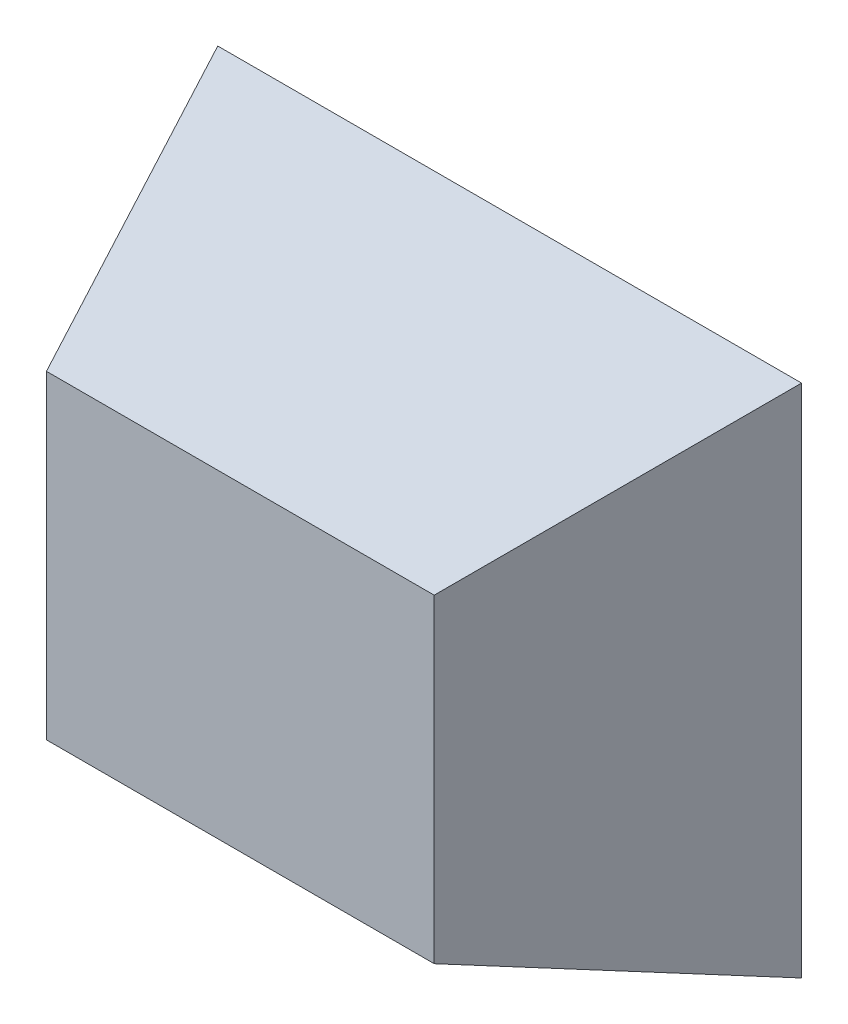
ISO-10303-21;
HEADER;
FILE_DESCRIPTION(('STEP AP214'),'2;1');
FILE_NAME('part.step','',(''),(''),'','','');
FILE_SCHEMA(('AUTOMOTIVE_DESIGN { 1 0 10303 214 1 1 1 1 }'));
ENDSEC;
DATA;
#1=APPLICATION_CONTEXT('core data for automotive mechanical design processes');
#2=APPLICATION_PROTOCOL_DEFINITION('international standard','automotive_design',2000,#1);
#3=PRODUCT_CONTEXT('',#1,'mechanical');
#4=PRODUCT('Part','Part','',(#3));
#5=PRODUCT_RELATED_PRODUCT_CATEGORY('part','',(#4));
#6=PRODUCT_DEFINITION_FORMATION('','',#4);
#7=PRODUCT_DEFINITION_CONTEXT('part definition',#1,'design');
#8=PRODUCT_DEFINITION('design','',#6,#7);
#9=PRODUCT_DEFINITION_SHAPE('','',#8);
#10=(LENGTH_UNIT() NAMED_UNIT(*) SI_UNIT(.MILLI.,.METRE.));
#11=(NAMED_UNIT(*) PLANE_ANGLE_UNIT() SI_UNIT($,.RADIAN.));
#12=(NAMED_UNIT(*) SI_UNIT($,.STERADIAN.) SOLID_ANGLE_UNIT());
#13=UNCERTAINTY_MEASURE_WITH_UNIT(LENGTH_MEASURE(1.E-05),#10,'distance_accuracy_value','');
#14=(GEOMETRIC_REPRESENTATION_CONTEXT(3) GLOBAL_UNCERTAINTY_ASSIGNED_CONTEXT((#13)) GLOBAL_UNIT_ASSIGNED_CONTEXT((#10,
#11,#12)) REPRESENTATION_CONTEXT('',''));
#15=CARTESIAN_POINT('',(0.,0.,0.));
#16=DIRECTION('',(0.,0.,1.));
#17=DIRECTION('',(1.,0.,0.));
#18=AXIS2_PLACEMENT_3D('',#15,#16,#17);
#19=CARTESIAN_POINT('',(0.,0.,0.));
#20=DIRECTION('',(-0.939692620785908,0.,0.342020143325669));
#21=DIRECTION('',(0.342020143325669,0.,0.939692620785908));
#22=AXIS2_PLACEMENT_3D('',#19,#20,#21);
#23=PLANE('',#22);
#24=DIRECTION('',(0.,-1.,0.));
#25=VECTOR('',#24,1.);
#26=CARTESIAN_POINT('',(0.,0.,0.));
#27=LINE('',#26,#25);
#28=CARTESIAN_POINT('',(0.,0.,0.));
#29=VERTEX_POINT('',#28);
#30=CARTESIAN_POINT('',(0.,-38.2597131047897,0.));
#31=VERTEX_POINT('',#30);
#32=EDGE_CURVE('E83',#29,#31,#27,.T.);
#33=ORIENTED_EDGE('',*,*,#32,.T.);
#34=DIRECTION('',(-0.323615577118185,-0.323615577118185,-0.889126490715988));
#35=VECTOR('',#34,1.);
#36=CARTESIAN_POINT('',(0.,-38.2597131047897,0.));
#37=LINE('',#36,#35);
#38=CARTESIAN_POINT('',(7.27940468532406,-30.9803084194656,20.));
#39=VERTEX_POINT('',#38);
#40=EDGE_CURVE('E11',#39,#31,#37,.T.);
#41=ORIENTED_EDGE('',*,*,#40,.F.);
#42=DIRECTION('',(0.,1.,0.));
#43=VECTOR('',#42,1.);
#44=CARTESIAN_POINT('',(7.27940468532406,0.,20.));
#45=LINE('',#44,#43);
#46=CARTESIAN_POINT('',(7.27940468532406,-7.27940468532406,20.));
#47=VERTEX_POINT('',#46);
#48=EDGE_CURVE('E99',#47,#39,#45,.F.);
#49=ORIENTED_EDGE('',*,*,#48,.F.);
#50=DIRECTION('',(-0.323615577118185,0.323615577118185,-0.889126490715988));
#51=VECTOR('',#50,1.);
#52=CARTESIAN_POINT('',(0.,0.,0.));
#53=LINE('',#52,#51);
#54=EDGE_CURVE('E94',#47,#29,#53,.T.);
#55=ORIENTED_EDGE('',*,*,#54,.T.);
#56=EDGE_LOOP('',(#33,#41,#49,#55));
#57=FACE_BOUND('',#56,.T.);
#58=ADVANCED_FACE('F37',(#57),#23,.T.);
#59=CARTESIAN_POINT('',(0.,-38.2597131047897,0.));
#60=DIRECTION('',(0.,-0.939692620785908,0.342020143325669));
#61=DIRECTION('',(0.,-0.342020143325669,-0.939692620785908));
#62=AXIS2_PLACEMENT_3D('',#59,#60,#61);
#63=PLANE('',#62);
#64=DIRECTION('',(1.,0.,0.));
#65=VECTOR('',#64,1.);
#66=CARTESIAN_POINT('',(0.,-38.2597131047897,0.));
#67=LINE('',#66,#65);
#68=CARTESIAN_POINT('',(43.3507233163141,-38.2597131047897,0.));
#69=VERTEX_POINT('',#68);
#70=EDGE_CURVE('E79',#31,#69,#67,.T.);
#71=ORIENTED_EDGE('',*,*,#70,.T.);
#72=DIRECTION('',(0.323615577118185,-0.323615577118185,-0.889126490715988));
#73=VECTOR('',#72,1.);
#74=CARTESIAN_POINT('',(39.3438967445105,-34.2528865329861,11.0086655297012));
#75=LINE('',#74,#73);
#76=CARTESIAN_POINT('',(36.0713186309901,-30.9803084194656,20.));
#77=VERTEX_POINT('',#76);
#78=EDGE_CURVE('E46',#77,#69,#75,.T.);
#79=ORIENTED_EDGE('',*,*,#78,.F.);
#80=DIRECTION('',(-1.,0.,0.));
#81=VECTOR('',#80,1.);
#82=CARTESIAN_POINT('',(0.,-30.9803084194656,20.));
#83=LINE('',#82,#81);
#84=EDGE_CURVE('E90',#39,#77,#83,.F.);
#85=ORIENTED_EDGE('',*,*,#84,.F.);
#86=ORIENTED_EDGE('',*,*,#40,.T.);
#87=EDGE_LOOP('',(#71,#79,#85,#86));
#88=FACE_BOUND('',#87,.T.);
#89=ADVANCED_FACE('F39',(#88),#63,.T.);
#90=CARTESIAN_POINT('',(43.3507233163141,0.,0.));
#91=DIRECTION('',(0.939692620785908,0.,0.342020143325669));
#92=DIRECTION('',(0.342020143325669,0.,-0.939692620785908));
#93=AXIS2_PLACEMENT_3D('',#90,#91,#92);
#94=PLANE('',#93);
#95=DIRECTION('',(0.,1.,0.));
#96=VECTOR('',#95,1.);
#97=CARTESIAN_POINT('',(43.3507233163141,0.,0.));
#98=LINE('',#97,#96);
#99=CARTESIAN_POINT('',(43.3507233163141,0.,0.));
#100=VERTEX_POINT('',#99);
#101=EDGE_CURVE('E84',#69,#100,#98,.T.);
#102=ORIENTED_EDGE('',*,*,#101,.T.);
#103=DIRECTION('',(0.323615577118185,0.323615577118185,-0.889126490715988));
#104=VECTOR('',#103,1.);
#105=CARTESIAN_POINT('',(38.8107303055205,-4.53999301079362,12.4735282816372));
#106=LINE('',#105,#104);
#107=CARTESIAN_POINT('',(36.0713186309901,-7.27940468532406,20.));
#108=VERTEX_POINT('',#107);
#109=EDGE_CURVE('E102',#108,#100,#106,.T.);
#110=ORIENTED_EDGE('',*,*,#109,.F.);
#111=DIRECTION('',(0.,-1.,0.));
#112=VECTOR('',#111,1.);
#113=CARTESIAN_POINT('',(36.0713186309901,0.,20.));
#114=LINE('',#113,#112);
#115=EDGE_CURVE('E58',#77,#108,#114,.F.);
#116=ORIENTED_EDGE('',*,*,#115,.F.);
#117=ORIENTED_EDGE('',*,*,#78,.T.);
#118=EDGE_LOOP('',(#102,#110,#116,#117));
#119=FACE_BOUND('',#118,.T.);
#120=ADVANCED_FACE('F109',(#119),#94,.T.);
#121=CARTESIAN_POINT('',(0.,0.,0.));
#122=DIRECTION('',(0.,0.939692620785908,0.342020143325669));
#123=DIRECTION('',(0.,-0.342020143325669,0.939692620785908));
#124=AXIS2_PLACEMENT_3D('',#121,#122,#123);
#125=PLANE('',#124);
#126=DIRECTION('',(-1.,0.,0.));
#127=VECTOR('',#126,1.);
#128=CARTESIAN_POINT('',(0.,0.,0.));
#129=LINE('',#128,#127);
#130=EDGE_CURVE('E98',#100,#29,#129,.T.);
#131=ORIENTED_EDGE('',*,*,#130,.T.);
#132=ORIENTED_EDGE('',*,*,#54,.F.);
#133=DIRECTION('',(1.,0.,0.));
#134=VECTOR('',#133,1.);
#135=CARTESIAN_POINT('',(0.,-7.27940468532406,20.));
#136=LINE('',#135,#134);
#137=EDGE_CURVE('E41',#108,#47,#136,.F.);
#138=ORIENTED_EDGE('',*,*,#137,.F.);
#139=ORIENTED_EDGE('',*,*,#109,.T.);
#140=EDGE_LOOP('',(#131,#132,#138,#139));
#141=FACE_BOUND('',#140,.T.);
#142=ADVANCED_FACE('F111',(#141),#125,.T.);
#143=CARTESIAN_POINT('',(0.,0.,20.));
#144=DIRECTION('',(0.,0.,1.));
#145=DIRECTION('',(1.,0.,0.));
#146=AXIS2_PLACEMENT_3D('',#143,#144,#145);
#147=PLANE('',#146);
#148=ORIENTED_EDGE('',*,*,#48,.T.);
#149=ORIENTED_EDGE('',*,*,#84,.T.);
#150=ORIENTED_EDGE('',*,*,#115,.T.);
#151=ORIENTED_EDGE('',*,*,#137,.T.);
#152=EDGE_LOOP('',(#148,#149,#150,#151));
#153=FACE_BOUND('',#152,.T.);
#154=ADVANCED_FACE('F107',(#153),#147,.T.);
#155=CARTESIAN_POINT('',(0.,0.,0.));
#156=DIRECTION('',(0.,0.,1.));
#157=DIRECTION('',(1.,0.,0.));
#158=AXIS2_PLACEMENT_3D('',#155,#156,#157);
#159=PLANE('',#158);
#160=ORIENTED_EDGE('',*,*,#32,.F.);
#161=ORIENTED_EDGE('',*,*,#130,.F.);
#162=ORIENTED_EDGE('',*,*,#101,.F.);
#163=ORIENTED_EDGE('',*,*,#70,.F.);
#164=EDGE_LOOP('',(#160,#161,#162,#163));
#165=FACE_BOUND('',#164,.T.);
#166=ADVANCED_FACE('F80',(#165),#159,.F.);
#167=CLOSED_SHELL('',(#58,#89,#120,#142,#154,#166));
#168=MANIFOLD_SOLID_BREP('B2',#167);
#169=ADVANCED_BREP_SHAPE_REPRESENTATION('',(#18,#168),#14);
#170=SHAPE_DEFINITION_REPRESENTATION(#9,#169);
ENDSEC;
END-ISO-10303-21;
